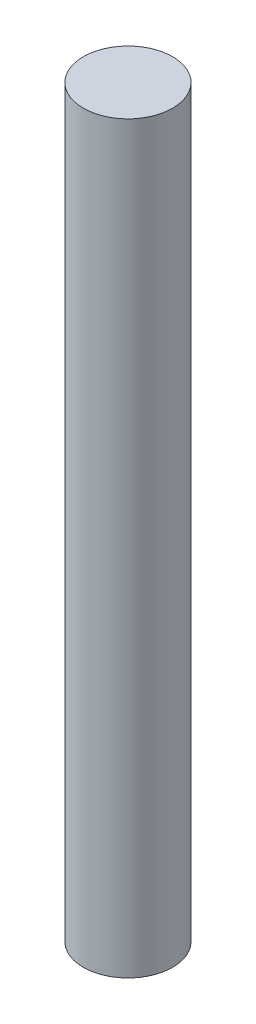
ISO-10303-21;
HEADER;
FILE_DESCRIPTION(('STEP AP214'),'2;1');
FILE_NAME('part.step','',(''),(''),'','','');
FILE_SCHEMA(('AUTOMOTIVE_DESIGN { 1 0 10303 214 1 1 1 1 }'));
ENDSEC;
DATA;
#1=APPLICATION_CONTEXT('core data for automotive mechanical design processes');
#2=APPLICATION_PROTOCOL_DEFINITION('international standard','automotive_design',2000,#1);
#3=PRODUCT_CONTEXT('',#1,'mechanical');
#4=PRODUCT('Part','Part','',(#3));
#5=PRODUCT_RELATED_PRODUCT_CATEGORY('part','',(#4));
#6=PRODUCT_DEFINITION_FORMATION('','',#4);
#7=PRODUCT_DEFINITION_CONTEXT('part definition',#1,'design');
#8=PRODUCT_DEFINITION('design','',#6,#7);
#9=PRODUCT_DEFINITION_SHAPE('','',#8);
#10=(LENGTH_UNIT() NAMED_UNIT(*) SI_UNIT(.MILLI.,.METRE.));
#11=(NAMED_UNIT(*) PLANE_ANGLE_UNIT() SI_UNIT($,.RADIAN.));
#12=(NAMED_UNIT(*) SI_UNIT($,.STERADIAN.) SOLID_ANGLE_UNIT());
#13=UNCERTAINTY_MEASURE_WITH_UNIT(LENGTH_MEASURE(1.E-05),#10,'distance_accuracy_value','');
#14=(GEOMETRIC_REPRESENTATION_CONTEXT(3) GLOBAL_UNCERTAINTY_ASSIGNED_CONTEXT((#13)) GLOBAL_UNIT_ASSIGNED_CONTEXT((#10,
#11,#12)) REPRESENTATION_CONTEXT('',''));
#15=CARTESIAN_POINT('',(0.,0.,0.));
#16=DIRECTION('',(0.,0.,1.));
#17=DIRECTION('',(1.,0.,0.));
#18=AXIS2_PLACEMENT_3D('',#15,#16,#17);
#19=CARTESIAN_POINT('',(0.,25.,0.));
#20=DIRECTION('',(0.,-1.,0.));
#21=DIRECTION('',(0.,0.,-1.));
#22=AXIS2_PLACEMENT_3D('',#19,#20,#21);
#23=CYLINDRICAL_SURFACE('',#22,1.5);
#24=CARTESIAN_POINT('',(0.,25.,0.));
#25=DIRECTION('',(0.,1.,0.));
#26=DIRECTION('',(0.,0.,1.));
#27=AXIS2_PLACEMENT_3D('',#24,#25,#26);
#28=CIRCLE('',#27,1.5);
#29=CARTESIAN_POINT('',(0.,25.,1.5));
#30=VERTEX_POINT('',#29);
#31=EDGE_CURVE('E10',#30,#30,#28,.T.);
#32=ORIENTED_EDGE('',*,*,#31,.F.);
#33=EDGE_LOOP('',(#32));
#34=FACE_BOUND('',#33,.T.);
#35=CARTESIAN_POINT('',(0.,0.,0.));
#36=DIRECTION('',(0.,1.,0.));
#37=DIRECTION('',(0.,0.,1.));
#38=AXIS2_PLACEMENT_3D('',#35,#36,#37);
#39=CIRCLE('',#38,1.5);
#40=CARTESIAN_POINT('',(0.,0.,1.5));
#41=VERTEX_POINT('',#40);
#42=EDGE_CURVE('E37',#41,#41,#39,.T.);
#43=ORIENTED_EDGE('',*,*,#42,.T.);
#44=EDGE_LOOP('',(#43));
#45=FACE_BOUND('',#44,.T.);
#46=ADVANCED_FACE('F34',(#34,#45),#23,.T.);
#47=CARTESIAN_POINT('',(0.,25.,0.));
#48=DIRECTION('',(0.,1.,0.));
#49=DIRECTION('',(0.,0.,1.));
#50=AXIS2_PLACEMENT_3D('',#47,#48,#49);
#51=PLANE('',#50);
#52=ORIENTED_EDGE('',*,*,#31,.T.);
#53=EDGE_LOOP('',(#52));
#54=FACE_BOUND('',#53,.T.);
#55=ADVANCED_FACE('F49',(#54),#51,.T.);
#56=CARTESIAN_POINT('',(0.,0.,0.));
#57=DIRECTION('',(0.,1.,0.));
#58=DIRECTION('',(0.,0.,1.));
#59=AXIS2_PLACEMENT_3D('',#56,#57,#58);
#60=PLANE('',#59);
#61=ORIENTED_EDGE('',*,*,#42,.F.);
#62=EDGE_LOOP('',(#61));
#63=FACE_BOUND('',#62,.T.);
#64=ADVANCED_FACE('F47',(#63),#60,.F.);
#65=CLOSED_SHELL('',(#46,#55,#64));
#66=MANIFOLD_SOLID_BREP('B2',#65);
#67=ADVANCED_BREP_SHAPE_REPRESENTATION('',(#18,#66),#14);
#68=SHAPE_DEFINITION_REPRESENTATION(#9,#67);
ENDSEC;
END-ISO-10303-21;
